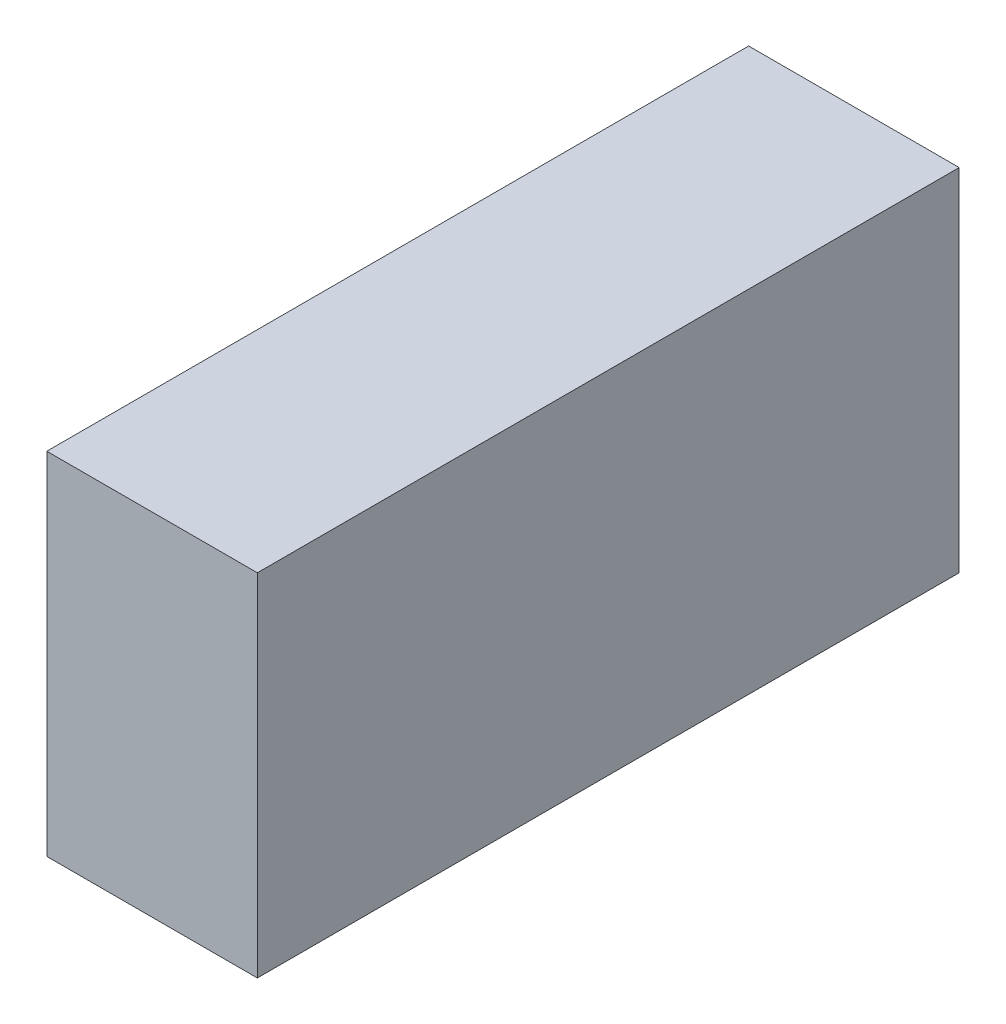
ISO-10303-21;
HEADER;
FILE_DESCRIPTION(('STEP AP214'),'2;1');
FILE_NAME('part.step','',(''),(''),'','','');
FILE_SCHEMA(('AUTOMOTIVE_DESIGN { 1 0 10303 214 1 1 1 1 }'));
ENDSEC;
DATA;
#1=APPLICATION_CONTEXT('core data for automotive mechanical design processes');
#2=APPLICATION_PROTOCOL_DEFINITION('international standard','automotive_design',2000,#1);
#3=PRODUCT_CONTEXT('',#1,'mechanical');
#4=PRODUCT('Part','Part','',(#3));
#5=PRODUCT_RELATED_PRODUCT_CATEGORY('part','',(#4));
#6=PRODUCT_DEFINITION_FORMATION('','',#4);
#7=PRODUCT_DEFINITION_CONTEXT('part definition',#1,'design');
#8=PRODUCT_DEFINITION('design','',#6,#7);
#9=PRODUCT_DEFINITION_SHAPE('','',#8);
#10=(LENGTH_UNIT() NAMED_UNIT(*) SI_UNIT(.MILLI.,.METRE.));
#11=(NAMED_UNIT(*) PLANE_ANGLE_UNIT() SI_UNIT($,.RADIAN.));
#12=(NAMED_UNIT(*) SI_UNIT($,.STERADIAN.) SOLID_ANGLE_UNIT());
#13=UNCERTAINTY_MEASURE_WITH_UNIT(LENGTH_MEASURE(1.E-05),#10,'distance_accuracy_value','');
#14=(GEOMETRIC_REPRESENTATION_CONTEXT(3) GLOBAL_UNCERTAINTY_ASSIGNED_CONTEXT((#13)) GLOBAL_UNIT_ASSIGNED_CONTEXT((#10,
#11,#12)) REPRESENTATION_CONTEXT('',''));
#15=CARTESIAN_POINT('',(0.,0.,0.));
#16=DIRECTION('',(0.,0.,1.));
#17=DIRECTION('',(1.,0.,0.));
#18=AXIS2_PLACEMENT_3D('',#15,#16,#17);
#19=CARTESIAN_POINT('',(60.,-100.,400.));
#20=DIRECTION('',(-1.,0.,0.));
#21=DIRECTION('',(0.,0.,1.));
#22=AXIS2_PLACEMENT_3D('',#19,#20,#21);
#23=PLANE('',#22);
#24=DIRECTION('',(0.,1.,0.));
#25=VECTOR('',#24,1.);
#26=CARTESIAN_POINT('',(60.,-100.,0.));
#27=LINE('',#26,#25);
#28=CARTESIAN_POINT('',(60.,-100.,0.));
#29=VERTEX_POINT('',#28);
#30=CARTESIAN_POINT('',(60.,100.,0.));
#31=VERTEX_POINT('',#30);
#32=EDGE_CURVE('E109',#29,#31,#27,.T.);
#33=ORIENTED_EDGE('',*,*,#32,.T.);
#34=DIRECTION('',(0.,0.,-1.));
#35=VECTOR('',#34,1.);
#36=CARTESIAN_POINT('',(60.,100.,400.));
#37=LINE('',#36,#35);
#38=CARTESIAN_POINT('',(60.,100.,400.));
#39=VERTEX_POINT('',#38);
#40=EDGE_CURVE('E11',#39,#31,#37,.T.);
#41=ORIENTED_EDGE('',*,*,#40,.F.);
#42=DIRECTION('',(0.,1.,0.));
#43=VECTOR('',#42,1.);
#44=CARTESIAN_POINT('',(60.,-100.,400.));
#45=LINE('',#44,#43);
#46=CARTESIAN_POINT('',(60.,-100.,400.));
#47=VERTEX_POINT('',#46);
#48=EDGE_CURVE('E93',#47,#39,#45,.T.);
#49=ORIENTED_EDGE('',*,*,#48,.F.);
#50=DIRECTION('',(0.,0.,-1.));
#51=VECTOR('',#50,1.);
#52=CARTESIAN_POINT('',(60.,-100.,400.));
#53=LINE('',#52,#51);
#54=EDGE_CURVE('E105',#47,#29,#53,.T.);
#55=ORIENTED_EDGE('',*,*,#54,.T.);
#56=EDGE_LOOP('',(#33,#41,#49,#55));
#57=FACE_BOUND('',#56,.T.);
#58=ADVANCED_FACE('F41',(#57),#23,.F.);
#59=CARTESIAN_POINT('',(-60.,100.,400.));
#60=DIRECTION('',(0.,-1.,0.));
#61=DIRECTION('',(0.,0.,-1.));
#62=AXIS2_PLACEMENT_3D('',#59,#60,#61);
#63=PLANE('',#62);
#64=DIRECTION('',(-1.,0.,0.));
#65=VECTOR('',#64,1.);
#66=CARTESIAN_POINT('',(-60.,100.,0.));
#67=LINE('',#66,#65);
#68=CARTESIAN_POINT('',(-60.,100.,0.));
#69=VERTEX_POINT('',#68);
#70=EDGE_CURVE('E98',#31,#69,#67,.T.);
#71=ORIENTED_EDGE('',*,*,#70,.T.);
#72=DIRECTION('',(0.,0.,-1.));
#73=VECTOR('',#72,1.);
#74=CARTESIAN_POINT('',(-60.,100.,400.));
#75=LINE('',#74,#73);
#76=CARTESIAN_POINT('',(-60.,100.,400.));
#77=VERTEX_POINT('',#76);
#78=EDGE_CURVE('E50',#77,#69,#75,.T.);
#79=ORIENTED_EDGE('',*,*,#78,.F.);
#80=DIRECTION('',(-1.,0.,0.));
#81=VECTOR('',#80,1.);
#82=CARTESIAN_POINT('',(-60.,100.,400.));
#83=LINE('',#82,#81);
#84=EDGE_CURVE('E88',#39,#77,#83,.T.);
#85=ORIENTED_EDGE('',*,*,#84,.F.);
#86=ORIENTED_EDGE('',*,*,#40,.T.);
#87=EDGE_LOOP('',(#71,#79,#85,#86));
#88=FACE_BOUND('',#87,.T.);
#89=ADVANCED_FACE('F97',(#88),#63,.F.);
#90=CARTESIAN_POINT('',(-60.,-100.,400.));
#91=DIRECTION('',(1.,0.,0.));
#92=DIRECTION('',(0.,0.,-1.));
#93=AXIS2_PLACEMENT_3D('',#90,#91,#92);
#94=PLANE('',#93);
#95=DIRECTION('',(0.,-1.,0.));
#96=VECTOR('',#95,1.);
#97=CARTESIAN_POINT('',(-60.,-100.,0.));
#98=LINE('',#97,#96);
#99=CARTESIAN_POINT('',(-60.,-100.,0.));
#100=VERTEX_POINT('',#99);
#101=EDGE_CURVE('E75',#69,#100,#98,.T.);
#102=ORIENTED_EDGE('',*,*,#101,.T.);
#103=DIRECTION('',(0.,0.,-1.));
#104=VECTOR('',#103,1.);
#105=CARTESIAN_POINT('',(-60.,-100.,400.));
#106=LINE('',#105,#104);
#107=CARTESIAN_POINT('',(-60.,-100.,400.));
#108=VERTEX_POINT('',#107);
#109=EDGE_CURVE('E100',#108,#100,#106,.T.);
#110=ORIENTED_EDGE('',*,*,#109,.F.);
#111=DIRECTION('',(0.,-1.,0.));
#112=VECTOR('',#111,1.);
#113=CARTESIAN_POINT('',(-60.,-100.,400.));
#114=LINE('',#113,#112);
#115=EDGE_CURVE('E91',#77,#108,#114,.T.);
#116=ORIENTED_EDGE('',*,*,#115,.F.);
#117=ORIENTED_EDGE('',*,*,#78,.T.);
#118=EDGE_LOOP('',(#102,#110,#116,#117));
#119=FACE_BOUND('',#118,.T.);
#120=ADVANCED_FACE('F101',(#119),#94,.F.);
#121=CARTESIAN_POINT('',(-60.,-100.,400.));
#122=DIRECTION('',(0.,1.,0.));
#123=DIRECTION('',(0.,0.,1.));
#124=AXIS2_PLACEMENT_3D('',#121,#122,#123);
#125=PLANE('',#124);
#126=DIRECTION('',(1.,0.,0.));
#127=VECTOR('',#126,1.);
#128=CARTESIAN_POINT('',(-60.,-100.,0.));
#129=LINE('',#128,#127);
#130=EDGE_CURVE('E81',#100,#29,#129,.T.);
#131=ORIENTED_EDGE('',*,*,#130,.T.);
#132=ORIENTED_EDGE('',*,*,#54,.F.);
#133=DIRECTION('',(1.,0.,0.));
#134=VECTOR('',#133,1.);
#135=CARTESIAN_POINT('',(-60.,-100.,400.));
#136=LINE('',#135,#134);
#137=EDGE_CURVE('E58',#108,#47,#136,.T.);
#138=ORIENTED_EDGE('',*,*,#137,.F.);
#139=ORIENTED_EDGE('',*,*,#109,.T.);
#140=EDGE_LOOP('',(#131,#132,#138,#139));
#141=FACE_BOUND('',#140,.T.);
#142=ADVANCED_FACE('F122',(#141),#125,.F.);
#143=CARTESIAN_POINT('',(0.,0.,400.));
#144=DIRECTION('',(0.,0.,-1.));
#145=DIRECTION('',(-1.,0.,0.));
#146=AXIS2_PLACEMENT_3D('',#143,#144,#145);
#147=PLANE('',#146);
#148=ORIENTED_EDGE('',*,*,#48,.T.);
#149=ORIENTED_EDGE('',*,*,#84,.T.);
#150=ORIENTED_EDGE('',*,*,#115,.T.);
#151=ORIENTED_EDGE('',*,*,#137,.T.);
#152=EDGE_LOOP('',(#148,#149,#150,#151));
#153=FACE_BOUND('',#152,.T.);
#154=ADVANCED_FACE('F89',(#153),#147,.F.);
#155=CARTESIAN_POINT('',(0.,0.,0.));
#156=DIRECTION('',(0.,0.,-1.));
#157=DIRECTION('',(-1.,0.,0.));
#158=AXIS2_PLACEMENT_3D('',#155,#156,#157);
#159=PLANE('',#158);
#160=ORIENTED_EDGE('',*,*,#32,.F.);
#161=ORIENTED_EDGE('',*,*,#130,.F.);
#162=ORIENTED_EDGE('',*,*,#101,.F.);
#163=ORIENTED_EDGE('',*,*,#70,.F.);
#164=EDGE_LOOP('',(#160,#161,#162,#163));
#165=FACE_BOUND('',#164,.T.);
#166=ADVANCED_FACE('F125',(#165),#159,.T.);
#167=CLOSED_SHELL('',(#58,#89,#120,#142,#154,#166));
#168=MANIFOLD_SOLID_BREP('B2',#167);
#169=ADVANCED_BREP_SHAPE_REPRESENTATION('',(#18,#168),#14);
#170=SHAPE_DEFINITION_REPRESENTATION(#9,#169);
ENDSEC;
END-ISO-10303-21;
